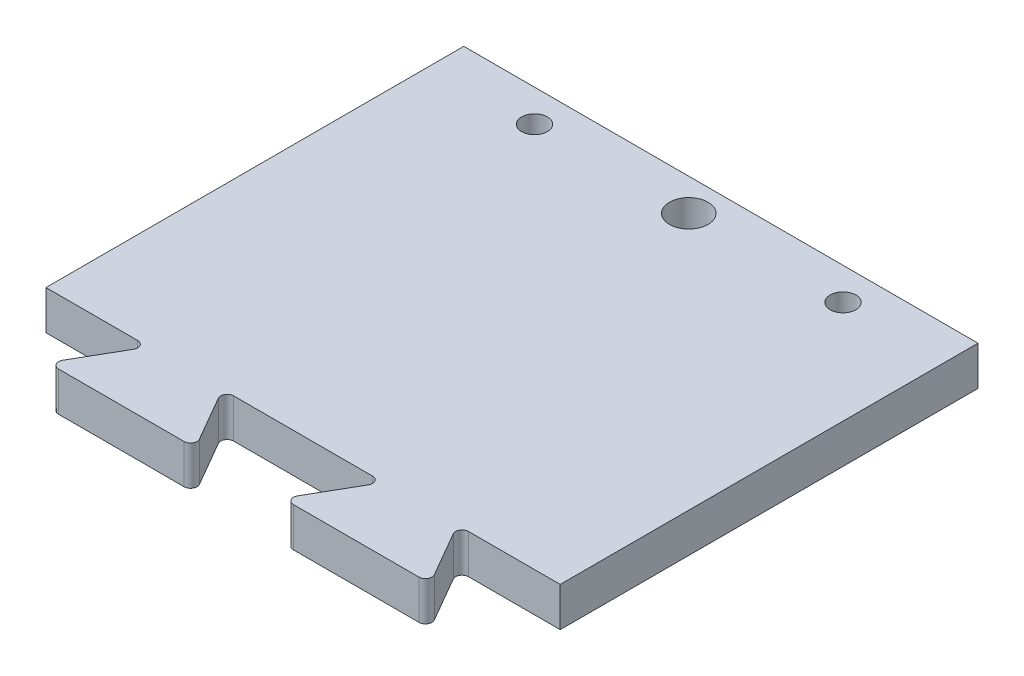
ISO-10303-21;
HEADER;
FILE_DESCRIPTION(('STEP AP214'),'2;1');
FILE_NAME('part.step','',(''),(''),'','','');
FILE_SCHEMA(('AUTOMOTIVE_DESIGN { 1 0 10303 214 1 1 1 1 }'));
ENDSEC;
DATA;
#1=APPLICATION_CONTEXT('core data for automotive mechanical design processes');
#2=APPLICATION_PROTOCOL_DEFINITION('international standard','automotive_design',2000,#1);
#3=PRODUCT_CONTEXT('',#1,'mechanical');
#4=PRODUCT('Part','Part','',(#3));
#5=PRODUCT_RELATED_PRODUCT_CATEGORY('part','',(#4));
#6=PRODUCT_DEFINITION_FORMATION('','',#4);
#7=PRODUCT_DEFINITION_CONTEXT('part definition',#1,'design');
#8=PRODUCT_DEFINITION('design','',#6,#7);
#9=PRODUCT_DEFINITION_SHAPE('','',#8);
#10=(LENGTH_UNIT() NAMED_UNIT(*) SI_UNIT(.MILLI.,.METRE.));
#11=(NAMED_UNIT(*) PLANE_ANGLE_UNIT() SI_UNIT($,.RADIAN.));
#12=(NAMED_UNIT(*) SI_UNIT($,.STERADIAN.) SOLID_ANGLE_UNIT());
#13=UNCERTAINTY_MEASURE_WITH_UNIT(LENGTH_MEASURE(1.E-05),#10,'distance_accuracy_value','');
#14=(GEOMETRIC_REPRESENTATION_CONTEXT(3) GLOBAL_UNCERTAINTY_ASSIGNED_CONTEXT((#13)) GLOBAL_UNIT_ASSIGNED_CONTEXT((#10,
#11,#12)) REPRESENTATION_CONTEXT('',''));
#15=CARTESIAN_POINT('',(0.,0.,0.));
#16=DIRECTION('',(0.,0.,1.));
#17=DIRECTION('',(1.,0.,0.));
#18=AXIS2_PLACEMENT_3D('',#15,#16,#17);
#19=CARTESIAN_POINT('',(8.,3.05,0.));
#20=DIRECTION('',(0.,0.,-1.));
#21=DIRECTION('',(-1.,0.,0.));
#22=AXIS2_PLACEMENT_3D('',#19,#20,#21);
#23=PLANE('',#22);
#24=DIRECTION('',(1.,0.,0.));
#25=VECTOR('',#24,1.);
#26=CARTESIAN_POINT('',(8.,0.,0.));
#27=LINE('',#26,#25);
#28=CARTESIAN_POINT('',(0.,0.,0.));
#29=VERTEX_POINT('',#28);
#30=CARTESIAN_POINT('',(7.13397459621556,0.,0.));
#31=VERTEX_POINT('',#30);
#32=EDGE_CURVE('E220',#29,#31,#27,.T.);
#33=ORIENTED_EDGE('',*,*,#32,.T.);
#34=DIRECTION('',(0.,-1.,0.));
#35=VECTOR('',#34,1.);
#36=CARTESIAN_POINT('',(7.13397459621556,3.05,0.));
#37=LINE('',#36,#35);
#38=CARTESIAN_POINT('',(7.13397459621556,3.05,0.));
#39=VERTEX_POINT('',#38);
#40=EDGE_CURVE('E359',#31,#39,#37,.F.);
#41=ORIENTED_EDGE('',*,*,#40,.T.);
#42=DIRECTION('',(1.,0.,0.));
#43=VECTOR('',#42,1.);
#44=CARTESIAN_POINT('',(8.,3.05,0.));
#45=LINE('',#44,#43);
#46=CARTESIAN_POINT('',(0.,3.05,0.));
#47=VERTEX_POINT('',#46);
#48=EDGE_CURVE('E263',#47,#39,#45,.T.);
#49=ORIENTED_EDGE('',*,*,#48,.F.);
#50=DIRECTION('',(0.,-1.,0.));
#51=VECTOR('',#50,1.);
#52=CARTESIAN_POINT('',(0.,3.05,0.));
#53=LINE('',#52,#51);
#54=EDGE_CURVE('E219',#47,#29,#53,.T.);
#55=ORIENTED_EDGE('',*,*,#54,.T.);
#56=EDGE_LOOP('',(#33,#41,#49,#55));
#57=FACE_BOUND('',#56,.T.);
#58=ADVANCED_FACE('F42',(#57),#23,.F.);
#59=CARTESIAN_POINT('',(5.11324865405184,3.05,5.));
#60=DIRECTION('',(0.866025403784436,0.,0.500000000000004));
#61=DIRECTION('',(0.500000000000004,0.,-0.866025403784436));
#62=AXIS2_PLACEMENT_3D('',#59,#60,#61);
#63=PLANE('',#62);
#64=DIRECTION('',(-0.500000000000004,0.,0.866025403784436));
#65=VECTOR('',#64,1.);
#66=CARTESIAN_POINT('',(5.11324865405184,0.,5.));
#67=LINE('',#66,#65);
#68=CARTESIAN_POINT('',(7.56698729810777,0.,0.750000000000002));
#69=VERTEX_POINT('',#68);
#70=CARTESIAN_POINT('',(5.54626135594406,0.,4.25));
#71=VERTEX_POINT('',#70);
#72=EDGE_CURVE('E224',#69,#71,#67,.T.);
#73=ORIENTED_EDGE('',*,*,#72,.T.);
#74=DIRECTION('',(0.,-1.,0.));
#75=VECTOR('',#74,1.);
#76=CARTESIAN_POINT('',(5.54626135594406,3.05,4.25));
#77=LINE('',#76,#75);
#78=CARTESIAN_POINT('',(5.54626135594406,3.05,4.25));
#79=VERTEX_POINT('',#78);
#80=EDGE_CURVE('E356',#71,#79,#77,.F.);
#81=ORIENTED_EDGE('',*,*,#80,.T.);
#82=DIRECTION('',(-0.500000000000004,0.,0.866025403784436));
#83=VECTOR('',#82,1.);
#84=CARTESIAN_POINT('',(5.11324865405184,3.05,5.));
#85=LINE('',#84,#83);
#86=CARTESIAN_POINT('',(7.56698729810777,3.05,0.750000000000002));
#87=VERTEX_POINT('',#86);
#88=EDGE_CURVE('E394',#87,#79,#85,.T.);
#89=ORIENTED_EDGE('',*,*,#88,.F.);
#90=DIRECTION('',(0.,-1.,0.));
#91=VECTOR('',#90,1.);
#92=CARTESIAN_POINT('',(7.56698729810777,0.,0.750000000000003));
#93=LINE('',#92,#91);
#94=EDGE_CURVE('E352',#87,#69,#93,.T.);
#95=ORIENTED_EDGE('',*,*,#94,.T.);
#96=EDGE_LOOP('',(#73,#81,#89,#95));
#97=FACE_BOUND('',#96,.T.);
#98=ADVANCED_FACE('F397',(#97),#63,.F.);
#99=CARTESIAN_POINT('',(16.6132486540518,3.05,5.));
#100=DIRECTION('',(0.,0.,-1.));
#101=DIRECTION('',(-1.,0.,0.));
#102=AXIS2_PLACEMENT_3D('',#99,#100,#101);
#103=PLANE('',#102);
#104=DIRECTION('',(1.,0.,0.));
#105=VECTOR('',#104,1.);
#106=CARTESIAN_POINT('',(16.6132486540518,0.,5.));
#107=LINE('',#106,#105);
#108=CARTESIAN_POINT('',(5.97927405783628,0.,5.));
#109=VERTEX_POINT('',#108);
#110=CARTESIAN_POINT('',(15.7472232502674,0.,5.));
#111=VERTEX_POINT('',#110);
#112=EDGE_CURVE('E229',#109,#111,#107,.T.);
#113=ORIENTED_EDGE('',*,*,#112,.T.);
#114=DIRECTION('',(0.,-1.,0.));
#115=VECTOR('',#114,1.);
#116=CARTESIAN_POINT('',(15.7472232502674,3.05,5.));
#117=LINE('',#116,#115);
#118=CARTESIAN_POINT('',(15.7472232502674,3.05,5.));
#119=VERTEX_POINT('',#118);
#120=EDGE_CURVE('E349',#111,#119,#117,.F.);
#121=ORIENTED_EDGE('',*,*,#120,.T.);
#122=DIRECTION('',(1.,0.,0.));
#123=VECTOR('',#122,1.);
#124=CARTESIAN_POINT('',(16.6132486540518,3.05,5.));
#125=LINE('',#124,#123);
#126=CARTESIAN_POINT('',(5.97927405783628,3.05,5.));
#127=VERTEX_POINT('',#126);
#128=EDGE_CURVE('E400',#127,#119,#125,.T.);
#129=ORIENTED_EDGE('',*,*,#128,.F.);
#130=DIRECTION('',(0.,-1.,0.));
#131=VECTOR('',#130,1.);
#132=CARTESIAN_POINT('',(5.97927405783628,3.05,5.));
#133=LINE('',#132,#131);
#134=EDGE_CURVE('E345',#127,#109,#133,.T.);
#135=ORIENTED_EDGE('',*,*,#134,.T.);
#136=EDGE_LOOP('',(#113,#121,#129,#135));
#137=FACE_BOUND('',#136,.T.);
#138=ADVANCED_FACE('F453',(#137),#103,.F.);
#139=CARTESIAN_POINT('',(13.7264973081037,3.05,0.));
#140=DIRECTION('',(-0.866025403784436,0.,0.500000000000004));
#141=DIRECTION('',(0.500000000000005,0.,0.866025403784436));
#142=AXIS2_PLACEMENT_3D('',#139,#140,#141);
#143=PLANE('',#142);
#144=DIRECTION('',(-0.500000000000005,0.,-0.866025403784436));
#145=VECTOR('',#144,1.);
#146=CARTESIAN_POINT('',(13.7264973081037,0.,0.));
#147=LINE('',#146,#145);
#148=CARTESIAN_POINT('',(16.1802359521596,0.,4.25));
#149=VERTEX_POINT('',#148);
#150=CARTESIAN_POINT('',(14.1595100099959,0.,0.750000000000005));
#151=VERTEX_POINT('',#150);
#152=EDGE_CURVE('E233',#149,#151,#147,.T.);
#153=ORIENTED_EDGE('',*,*,#152,.T.);
#154=DIRECTION('',(0.,-1.,0.));
#155=VECTOR('',#154,1.);
#156=CARTESIAN_POINT('',(14.1595100099959,3.05,0.750000000000005));
#157=LINE('',#156,#155);
#158=CARTESIAN_POINT('',(14.1595100099959,3.05,0.750000000000005));
#159=VERTEX_POINT('',#158);
#160=EDGE_CURVE('E342',#151,#159,#157,.F.);
#161=ORIENTED_EDGE('',*,*,#160,.T.);
#162=DIRECTION('',(-0.500000000000005,0.,-0.866025403784436));
#163=VECTOR('',#162,1.);
#164=CARTESIAN_POINT('',(13.7264973081037,3.05,0.));
#165=LINE('',#164,#163);
#166=CARTESIAN_POINT('',(16.1802359521596,3.05,4.25));
#167=VERTEX_POINT('',#166);
#168=EDGE_CURVE('E405',#167,#159,#165,.T.);
#169=ORIENTED_EDGE('',*,*,#168,.F.);
#170=DIRECTION('',(0.,-1.,0.));
#171=VECTOR('',#170,1.);
#172=CARTESIAN_POINT('',(16.1802359521596,3.05,4.25));
#173=LINE('',#172,#171);
#174=EDGE_CURVE('E338',#167,#149,#173,.T.);
#175=ORIENTED_EDGE('',*,*,#174,.T.);
#176=EDGE_LOOP('',(#153,#161,#169,#175));
#177=FACE_BOUND('',#176,.T.);
#178=ADVANCED_FACE('F495',(#177),#143,.F.);
#179=CARTESIAN_POINT('',(26.2735026918963,3.05,0.));
#180=DIRECTION('',(0.,0.,-1.));
#181=DIRECTION('',(-1.,0.,0.));
#182=AXIS2_PLACEMENT_3D('',#179,#180,#181);
#183=PLANE('',#182);
#184=DIRECTION('',(1.,0.,0.));
#185=VECTOR('',#184,1.);
#186=CARTESIAN_POINT('',(26.2735026918963,0.,0.));
#187=LINE('',#186,#185);
#188=CARTESIAN_POINT('',(14.5925227118881,0.,0.));
#189=VERTEX_POINT('',#188);
#190=CARTESIAN_POINT('',(25.4074772881119,0.,0.));
#191=VERTEX_POINT('',#190);
#192=EDGE_CURVE('E237',#189,#191,#187,.T.);
#193=ORIENTED_EDGE('',*,*,#192,.T.);
#194=DIRECTION('',(0.,-1.,0.));
#195=VECTOR('',#194,1.);
#196=CARTESIAN_POINT('',(25.4074772881119,3.05,0.));
#197=LINE('',#196,#195);
#198=CARTESIAN_POINT('',(25.4074772881119,3.05,0.));
#199=VERTEX_POINT('',#198);
#200=EDGE_CURVE('E335',#191,#199,#197,.F.);
#201=ORIENTED_EDGE('',*,*,#200,.T.);
#202=DIRECTION('',(1.,0.,0.));
#203=VECTOR('',#202,1.);
#204=CARTESIAN_POINT('',(26.2735026918963,3.05,0.));
#205=LINE('',#204,#203);
#206=CARTESIAN_POINT('',(14.5925227118881,3.05,0.));
#207=VERTEX_POINT('',#206);
#208=EDGE_CURVE('E413',#207,#199,#205,.T.);
#209=ORIENTED_EDGE('',*,*,#208,.F.);
#210=DIRECTION('',(0.,-1.,0.));
#211=VECTOR('',#210,1.);
#212=CARTESIAN_POINT('',(14.5925227118881,0.,0.));
#213=LINE('',#212,#211);
#214=EDGE_CURVE('E331',#207,#189,#213,.T.);
#215=ORIENTED_EDGE('',*,*,#214,.T.);
#216=EDGE_LOOP('',(#193,#201,#209,#215));
#217=FACE_BOUND('',#216,.T.);
#218=ADVANCED_FACE('F501',(#217),#183,.F.);
#219=CARTESIAN_POINT('',(23.3867513459482,3.05,5.));
#220=DIRECTION('',(0.866025403784436,0.,0.500000000000004));
#221=DIRECTION('',(0.500000000000004,0.,-0.866025403784436));
#222=AXIS2_PLACEMENT_3D('',#219,#220,#221);
#223=PLANE('',#222);
#224=DIRECTION('',(-0.500000000000004,0.,0.866025403784436));
#225=VECTOR('',#224,1.);
#226=CARTESIAN_POINT('',(23.3867513459482,0.,5.));
#227=LINE('',#226,#225);
#228=CARTESIAN_POINT('',(25.8404899900041,0.,0.750000000000001));
#229=VERTEX_POINT('',#228);
#230=CARTESIAN_POINT('',(23.8197640478404,0.,4.25));
#231=VERTEX_POINT('',#230);
#232=EDGE_CURVE('E241',#229,#231,#227,.T.);
#233=ORIENTED_EDGE('',*,*,#232,.T.);
#234=DIRECTION('',(0.,-1.,0.));
#235=VECTOR('',#234,1.);
#236=CARTESIAN_POINT('',(23.8197640478404,3.05,4.25));
#237=LINE('',#236,#235);
#238=CARTESIAN_POINT('',(23.8197640478404,3.05,4.25));
#239=VERTEX_POINT('',#238);
#240=EDGE_CURVE('E58',#231,#239,#237,.F.);
#241=ORIENTED_EDGE('',*,*,#240,.T.);
#242=DIRECTION('',(-0.500000000000004,0.,0.866025403784436));
#243=VECTOR('',#242,1.);
#244=CARTESIAN_POINT('',(23.3867513459482,3.05,5.));
#245=LINE('',#244,#243);
#246=CARTESIAN_POINT('',(25.8404899900041,3.05,0.750000000000001));
#247=VERTEX_POINT('',#246);
#248=EDGE_CURVE('E416',#247,#239,#245,.T.);
#249=ORIENTED_EDGE('',*,*,#248,.F.);
#250=DIRECTION('',(0.,-1.,0.));
#251=VECTOR('',#250,1.);
#252=CARTESIAN_POINT('',(25.8404899900041,0.,0.750000000000001));
#253=LINE('',#252,#251);
#254=EDGE_CURVE('E325',#247,#229,#253,.T.);
#255=ORIENTED_EDGE('',*,*,#254,.T.);
#256=EDGE_LOOP('',(#233,#241,#249,#255));
#257=FACE_BOUND('',#256,.T.);
#258=ADVANCED_FACE('F506',(#257),#223,.F.);
#259=CARTESIAN_POINT('',(34.8867513459482,3.05,5.));
#260=DIRECTION('',(0.,0.,-1.));
#261=DIRECTION('',(-1.,0.,0.));
#262=AXIS2_PLACEMENT_3D('',#259,#260,#261);
#263=PLANE('',#262);
#264=DIRECTION('',(1.,0.,0.));
#265=VECTOR('',#264,1.);
#266=CARTESIAN_POINT('',(34.8867513459482,0.,5.));
#267=LINE('',#266,#265);
#268=CARTESIAN_POINT('',(24.2527767497326,0.,5.));
#269=VERTEX_POINT('',#268);
#270=CARTESIAN_POINT('',(34.0207259421637,0.,5.));
#271=VERTEX_POINT('',#270);
#272=EDGE_CURVE('E244',#269,#271,#267,.T.);
#273=ORIENTED_EDGE('',*,*,#272,.T.);
#274=DIRECTION('',(0.,-1.,0.));
#275=VECTOR('',#274,1.);
#276=CARTESIAN_POINT('',(34.0207259421637,3.05,5.));
#277=LINE('',#276,#275);
#278=CARTESIAN_POINT('',(34.0207259421637,3.05,5.));
#279=VERTEX_POINT('',#278);
#280=EDGE_CURVE('E310',#271,#279,#277,.F.);
#281=ORIENTED_EDGE('',*,*,#280,.T.);
#282=DIRECTION('',(1.,0.,0.));
#283=VECTOR('',#282,1.);
#284=CARTESIAN_POINT('',(34.8867513459482,3.05,5.));
#285=LINE('',#284,#283);
#286=CARTESIAN_POINT('',(24.2527767497326,3.05,5.));
#287=VERTEX_POINT('',#286);
#288=EDGE_CURVE('E419',#287,#279,#285,.T.);
#289=ORIENTED_EDGE('',*,*,#288,.F.);
#290=DIRECTION('',(0.,-1.,0.));
#291=VECTOR('',#290,1.);
#292=CARTESIAN_POINT('',(24.2527767497326,3.05,5.));
#293=LINE('',#292,#291);
#294=EDGE_CURVE('E306',#287,#269,#293,.T.);
#295=ORIENTED_EDGE('',*,*,#294,.T.);
#296=EDGE_LOOP('',(#273,#281,#289,#295));
#297=FACE_BOUND('',#296,.T.);
#298=ADVANCED_FACE('F512',(#297),#263,.F.);
#299=CARTESIAN_POINT('',(32.,3.05,0.));
#300=DIRECTION('',(-0.866025403784436,0.,0.500000000000004));
#301=DIRECTION('',(0.500000000000004,0.,0.866025403784436));
#302=AXIS2_PLACEMENT_3D('',#299,#300,#301);
#303=PLANE('',#302);
#304=DIRECTION('',(-0.500000000000004,0.,-0.866025403784436));
#305=VECTOR('',#304,1.);
#306=CARTESIAN_POINT('',(32.,0.,0.));
#307=LINE('',#306,#305);
#308=CARTESIAN_POINT('',(34.4537386440559,0.,4.25));
#309=VERTEX_POINT('',#308);
#310=CARTESIAN_POINT('',(32.4330127018922,0.,0.750000000000007));
#311=VERTEX_POINT('',#310);
#312=EDGE_CURVE('E248',#309,#311,#307,.T.);
#313=ORIENTED_EDGE('',*,*,#312,.T.);
#314=DIRECTION('',(0.,-1.,0.));
#315=VECTOR('',#314,1.);
#316=CARTESIAN_POINT('',(32.4330127018922,3.05,0.750000000000006));
#317=LINE('',#316,#315);
#318=CARTESIAN_POINT('',(32.4330127018922,3.05,0.750000000000007));
#319=VERTEX_POINT('',#318);
#320=EDGE_CURVE('E291',#311,#319,#317,.F.);
#321=ORIENTED_EDGE('',*,*,#320,.T.);
#322=DIRECTION('',(-0.500000000000004,0.,-0.866025403784436));
#323=VECTOR('',#322,1.);
#324=CARTESIAN_POINT('',(32.,3.05,0.));
#325=LINE('',#324,#323);
#326=CARTESIAN_POINT('',(34.4537386440559,3.05,4.25));
#327=VERTEX_POINT('',#326);
#328=EDGE_CURVE('E193',#327,#319,#325,.T.);
#329=ORIENTED_EDGE('',*,*,#328,.F.);
#330=DIRECTION('',(0.,-1.,0.));
#331=VECTOR('',#330,1.);
#332=CARTESIAN_POINT('',(34.4537386440559,3.05,4.25));
#333=LINE('',#332,#331);
#334=EDGE_CURVE('E287',#327,#309,#333,.T.);
#335=ORIENTED_EDGE('',*,*,#334,.T.);
#336=EDGE_LOOP('',(#313,#321,#329,#335));
#337=FACE_BOUND('',#336,.T.);
#338=ADVANCED_FACE('F514',(#337),#303,.F.);
#339=CARTESIAN_POINT('',(40.,3.05,0.));
#340=DIRECTION('',(0.,0.,-1.));
#341=DIRECTION('',(-1.,0.,0.));
#342=AXIS2_PLACEMENT_3D('',#339,#340,#341);
#343=PLANE('',#342);
#344=DIRECTION('',(1.,0.,0.));
#345=VECTOR('',#344,1.);
#346=CARTESIAN_POINT('',(40.,3.05,0.));
#347=LINE('',#346,#345);
#348=CARTESIAN_POINT('',(32.8660254037845,3.05,0.));
#349=VERTEX_POINT('',#348);
#350=CARTESIAN_POINT('',(40.,3.05,0.));
#351=VERTEX_POINT('',#350);
#352=EDGE_CURVE('E179',#349,#351,#347,.T.);
#353=ORIENTED_EDGE('',*,*,#352,.F.);
#354=DIRECTION('',(0.,-1.,0.));
#355=VECTOR('',#354,1.);
#356=CARTESIAN_POINT('',(32.8660254037845,0.,0.));
#357=LINE('',#356,#355);
#358=CARTESIAN_POINT('',(32.8660254037845,0.,0.));
#359=VERTEX_POINT('',#358);
#360=EDGE_CURVE('E203',#349,#359,#357,.T.);
#361=ORIENTED_EDGE('',*,*,#360,.T.);
#362=DIRECTION('',(1.,0.,0.));
#363=VECTOR('',#362,1.);
#364=CARTESIAN_POINT('',(40.,0.,0.));
#365=LINE('',#364,#363);
#366=CARTESIAN_POINT('',(40.,0.,0.));
#367=VERTEX_POINT('',#366);
#368=EDGE_CURVE('E199',#359,#367,#365,.T.);
#369=ORIENTED_EDGE('',*,*,#368,.T.);
#370=DIRECTION('',(0.,-1.,0.));
#371=VECTOR('',#370,1.);
#372=CARTESIAN_POINT('',(40.,3.05,0.));
#373=LINE('',#372,#371);
#374=EDGE_CURVE('E196',#351,#367,#373,.T.);
#375=ORIENTED_EDGE('',*,*,#374,.F.);
#376=EDGE_LOOP('',(#353,#361,#369,#375));
#377=FACE_BOUND('',#376,.T.);
#378=ADVANCED_FACE('F197',(#377),#343,.F.);
#379=CARTESIAN_POINT('',(40.,3.05,-32.5));
#380=DIRECTION('',(-1.,0.,0.));
#381=DIRECTION('',(0.,0.,1.));
#382=AXIS2_PLACEMENT_3D('',#379,#380,#381);
#383=PLANE('',#382);
#384=DIRECTION('',(0.,0.,-1.));
#385=VECTOR('',#384,1.);
#386=CARTESIAN_POINT('',(40.,0.,-32.5));
#387=LINE('',#386,#385);
#388=CARTESIAN_POINT('',(40.,0.,-32.5));
#389=VERTEX_POINT('',#388);
#390=EDGE_CURVE('E254',#367,#389,#387,.T.);
#391=ORIENTED_EDGE('',*,*,#390,.T.);
#392=DIRECTION('',(0.,-1.,0.));
#393=VECTOR('',#392,1.);
#394=CARTESIAN_POINT('',(40.,3.05,-32.5));
#395=LINE('',#394,#393);
#396=CARTESIAN_POINT('',(40.,3.05,-32.5));
#397=VERTEX_POINT('',#396);
#398=EDGE_CURVE('E204',#397,#389,#395,.T.);
#399=ORIENTED_EDGE('',*,*,#398,.F.);
#400=DIRECTION('',(0.,0.,-1.));
#401=VECTOR('',#400,1.);
#402=CARTESIAN_POINT('',(40.,3.05,-32.5));
#403=LINE('',#402,#401);
#404=EDGE_CURVE('E184',#351,#397,#403,.T.);
#405=ORIENTED_EDGE('',*,*,#404,.F.);
#406=ORIENTED_EDGE('',*,*,#374,.T.);
#407=EDGE_LOOP('',(#391,#399,#405,#406));
#408=FACE_BOUND('',#407,.T.);
#409=ADVANCED_FACE('F206',(#408),#383,.F.);
#410=CARTESIAN_POINT('',(0.,3.05,-32.5));
#411=DIRECTION('',(0.,0.,1.));
#412=DIRECTION('',(1.,0.,0.));
#413=AXIS2_PLACEMENT_3D('',#410,#411,#412);
#414=PLANE('',#413);
#415=DIRECTION('',(-1.,0.,0.));
#416=VECTOR('',#415,1.);
#417=CARTESIAN_POINT('',(0.,0.,-32.5));
#418=LINE('',#417,#416);
#419=CARTESIAN_POINT('',(0.,0.,-32.5));
#420=VERTEX_POINT('',#419);
#421=EDGE_CURVE('E257',#389,#420,#418,.T.);
#422=ORIENTED_EDGE('',*,*,#421,.T.);
#423=DIRECTION('',(0.,-1.,0.));
#424=VECTOR('',#423,1.);
#425=CARTESIAN_POINT('',(0.,3.05,-32.5));
#426=LINE('',#425,#424);
#427=CARTESIAN_POINT('',(0.,3.05,-32.5));
#428=VERTEX_POINT('',#427);
#429=EDGE_CURVE('E267',#428,#420,#426,.T.);
#430=ORIENTED_EDGE('',*,*,#429,.F.);
#431=DIRECTION('',(-1.,0.,0.));
#432=VECTOR('',#431,1.);
#433=CARTESIAN_POINT('',(0.,3.05,-32.5));
#434=LINE('',#433,#432);
#435=EDGE_CURVE('E210',#397,#428,#434,.T.);
#436=ORIENTED_EDGE('',*,*,#435,.F.);
#437=ORIENTED_EDGE('',*,*,#398,.T.);
#438=EDGE_LOOP('',(#422,#430,#436,#437));
#439=FACE_BOUND('',#438,.T.);
#440=ADVANCED_FACE('F431',(#439),#414,.F.);
#441=CARTESIAN_POINT('',(0.,3.05,0.));
#442=DIRECTION('',(1.,0.,0.));
#443=DIRECTION('',(0.,0.,-1.));
#444=AXIS2_PLACEMENT_3D('',#441,#442,#443);
#445=PLANE('',#444);
#446=DIRECTION('',(0.,0.,1.));
#447=VECTOR('',#446,1.);
#448=CARTESIAN_POINT('',(0.,0.,0.));
#449=LINE('',#448,#447);
#450=EDGE_CURVE('E260',#420,#29,#449,.T.);
#451=ORIENTED_EDGE('',*,*,#450,.T.);
#452=ORIENTED_EDGE('',*,*,#54,.F.);
#453=DIRECTION('',(0.,0.,1.));
#454=VECTOR('',#453,1.);
#455=CARTESIAN_POINT('',(0.,3.05,0.));
#456=LINE('',#455,#454);
#457=EDGE_CURVE('E213',#428,#47,#456,.T.);
#458=ORIENTED_EDGE('',*,*,#457,.F.);
#459=ORIENTED_EDGE('',*,*,#429,.T.);
#460=EDGE_LOOP('',(#451,#452,#458,#459));
#461=FACE_BOUND('',#460,.T.);
#462=ADVANCED_FACE('F435',(#461),#445,.F.);
#463=CARTESIAN_POINT('',(0.,3.05,0.));
#464=DIRECTION('',(0.,-1.,0.));
#465=DIRECTION('',(0.,0.,-1.));
#466=AXIS2_PLACEMENT_3D('',#463,#464,#465);
#467=PLANE('',#466);
#468=CARTESIAN_POINT('',(8.,3.05,-30.));
#469=DIRECTION('',(0.,1.,0.));
#470=DIRECTION('',(0.,0.,1.));
#471=AXIS2_PLACEMENT_3D('',#468,#469,#470);
#472=CIRCLE('',#471,1.);
#473=CARTESIAN_POINT('',(8.,3.05,-29.));
#474=VERTEX_POINT('',#473);
#475=EDGE_CURVE('E278',#474,#474,#472,.T.);
#476=ORIENTED_EDGE('',*,*,#475,.F.);
#477=EDGE_LOOP('',(#476));
#478=FACE_BOUND('',#477,.T.);
#479=CARTESIAN_POINT('',(32.,3.05,-30.));
#480=DIRECTION('',(0.,1.,0.));
#481=DIRECTION('',(0.,0.,1.));
#482=AXIS2_PLACEMENT_3D('',#479,#480,#481);
#483=CIRCLE('',#482,0.999999999999998);
#484=CARTESIAN_POINT('',(32.,3.05,-29.));
#485=VERTEX_POINT('',#484);
#486=EDGE_CURVE('E746',#485,#485,#483,.T.);
#487=ORIENTED_EDGE('',*,*,#486,.F.);
#488=EDGE_LOOP('',(#487));
#489=FACE_BOUND('',#488,.T.);
#490=CARTESIAN_POINT('',(20.,3.05,-30.));
#491=DIRECTION('',(0.,1.,0.));
#492=DIRECTION('',(0.,0.,1.));
#493=AXIS2_PLACEMENT_3D('',#490,#491,#492);
#494=CIRCLE('',#493,1.5);
#495=CARTESIAN_POINT('',(20.,3.05,-28.5));
#496=VERTEX_POINT('',#495);
#497=EDGE_CURVE('E743',#496,#496,#494,.T.);
#498=ORIENTED_EDGE('',*,*,#497,.F.);
#499=EDGE_LOOP('',(#498));
#500=FACE_BOUND('',#499,.T.);
#501=ORIENTED_EDGE('',*,*,#288,.T.);
#502=CARTESIAN_POINT('',(34.0207259421637,3.05,4.5));
#503=DIRECTION('',(0.,-1.,0.));
#504=DIRECTION('',(0.,0.,-1.));
#505=AXIS2_PLACEMENT_3D('',#502,#503,#504);
#506=CIRCLE('',#505,0.5);
#507=EDGE_CURVE('E322',#279,#327,#506,.F.);
#508=ORIENTED_EDGE('',*,*,#507,.T.);
#509=ORIENTED_EDGE('',*,*,#328,.T.);
#510=CARTESIAN_POINT('',(32.8660254037845,3.05,0.500000000000001));
#511=DIRECTION('',(0.,-1.,0.));
#512=DIRECTION('',(0.,0.,-1.));
#513=AXIS2_PLACEMENT_3D('',#510,#511,#512);
#514=CIRCLE('',#513,0.5);
#515=EDGE_CURVE('E188',#319,#349,#514,.T.);
#516=ORIENTED_EDGE('',*,*,#515,.T.);
#517=ORIENTED_EDGE('',*,*,#352,.T.);
#518=ORIENTED_EDGE('',*,*,#404,.T.);
#519=ORIENTED_EDGE('',*,*,#435,.T.);
#520=ORIENTED_EDGE('',*,*,#457,.T.);
#521=ORIENTED_EDGE('',*,*,#48,.T.);
#522=CARTESIAN_POINT('',(7.13397459621556,3.05,0.5));
#523=DIRECTION('',(0.,-1.,0.));
#524=DIRECTION('',(0.,0.,-1.));
#525=AXIS2_PLACEMENT_3D('',#522,#523,#524);
#526=CIRCLE('',#525,0.5);
#527=EDGE_CURVE('E11',#39,#87,#526,.T.);
#528=ORIENTED_EDGE('',*,*,#527,.T.);
#529=ORIENTED_EDGE('',*,*,#88,.T.);
#530=CARTESIAN_POINT('',(5.97927405783628,3.05,4.5));
#531=DIRECTION('',(0.,-1.,0.));
#532=DIRECTION('',(0.,0.,-1.));
#533=AXIS2_PLACEMENT_3D('',#530,#531,#532);
#534=CIRCLE('',#533,0.5);
#535=EDGE_CURVE('E313',#79,#127,#534,.F.);
#536=ORIENTED_EDGE('',*,*,#535,.T.);
#537=ORIENTED_EDGE('',*,*,#128,.T.);
#538=CARTESIAN_POINT('',(15.7472232502674,3.05,4.5));
#539=DIRECTION('',(0.,-1.,0.));
#540=DIRECTION('',(0.,0.,-1.));
#541=AXIS2_PLACEMENT_3D('',#538,#539,#540);
#542=CIRCLE('',#541,0.5);
#543=EDGE_CURVE('E316',#119,#167,#542,.F.);
#544=ORIENTED_EDGE('',*,*,#543,.T.);
#545=ORIENTED_EDGE('',*,*,#168,.T.);
#546=CARTESIAN_POINT('',(14.5925227118881,3.05,0.500000000000001));
#547=DIRECTION('',(0.,-1.,0.));
#548=DIRECTION('',(0.,0.,-1.));
#549=AXIS2_PLACEMENT_3D('',#546,#547,#548);
#550=CIRCLE('',#549,0.5);
#551=EDGE_CURVE('E375',#159,#207,#550,.T.);
#552=ORIENTED_EDGE('',*,*,#551,.T.);
#553=ORIENTED_EDGE('',*,*,#208,.T.);
#554=CARTESIAN_POINT('',(25.4074772881119,3.05,0.499999999999999));
#555=DIRECTION('',(0.,-1.,0.));
#556=DIRECTION('',(0.,0.,-1.));
#557=AXIS2_PLACEMENT_3D('',#554,#555,#556);
#558=CIRCLE('',#557,0.5);
#559=EDGE_CURVE('E65',#199,#247,#558,.T.);
#560=ORIENTED_EDGE('',*,*,#559,.T.);
#561=ORIENTED_EDGE('',*,*,#248,.T.);
#562=CARTESIAN_POINT('',(24.2527767497326,3.05,4.5));
#563=DIRECTION('',(0.,-1.,0.));
#564=DIRECTION('',(0.,0.,-1.));
#565=AXIS2_PLACEMENT_3D('',#562,#563,#564);
#566=CIRCLE('',#565,0.5);
#567=EDGE_CURVE('E319',#239,#287,#566,.F.);
#568=ORIENTED_EDGE('',*,*,#567,.T.);
#569=EDGE_LOOP('',(#501,#508,#509,#516,#517,#518,#519,#520,#521,#528,#529,#536,#537,#544,#545,
#552,#553,#560,#561,#568));
#570=FACE_BOUND('',#569,.T.);
#571=ADVANCED_FACE('F182',(#478,#489,#500,#570),#467,.F.);
#572=CARTESIAN_POINT('',(0.,0.,0.));
#573=DIRECTION('',(0.,-1.,0.));
#574=DIRECTION('',(0.,0.,-1.));
#575=AXIS2_PLACEMENT_3D('',#572,#573,#574);
#576=PLANE('',#575);
#577=CARTESIAN_POINT('',(8.,0.,-30.));
#578=DIRECTION('',(0.,-1.,0.));
#579=DIRECTION('',(0.,0.,-1.));
#580=AXIS2_PLACEMENT_3D('',#577,#578,#579);
#581=CIRCLE('',#580,1.);
#582=CARTESIAN_POINT('',(8.,0.,-31.));
#583=VERTEX_POINT('',#582);
#584=EDGE_CURVE('E225',#583,#583,#581,.T.);
#585=ORIENTED_EDGE('',*,*,#584,.F.);
#586=EDGE_LOOP('',(#585));
#587=FACE_BOUND('',#586,.T.);
#588=CARTESIAN_POINT('',(32.,0.,-30.));
#589=DIRECTION('',(0.,-1.,0.));
#590=DIRECTION('',(0.,0.,-1.));
#591=AXIS2_PLACEMENT_3D('',#588,#589,#590);
#592=CIRCLE('',#591,0.999999999999998);
#593=CARTESIAN_POINT('',(32.,0.,-31.));
#594=VERTEX_POINT('',#593);
#595=EDGE_CURVE('E277',#594,#594,#592,.T.);
#596=ORIENTED_EDGE('',*,*,#595,.F.);
#597=EDGE_LOOP('',(#596));
#598=FACE_BOUND('',#597,.T.);
#599=CARTESIAN_POINT('',(20.,0.,-30.));
#600=DIRECTION('',(0.,-1.,0.));
#601=DIRECTION('',(0.,0.,-1.));
#602=AXIS2_PLACEMENT_3D('',#599,#600,#601);
#603=CIRCLE('',#602,1.5);
#604=CARTESIAN_POINT('',(20.,0.,-31.5));
#605=VERTEX_POINT('',#604);
#606=EDGE_CURVE('E273',#605,#605,#603,.T.);
#607=ORIENTED_EDGE('',*,*,#606,.F.);
#608=EDGE_LOOP('',(#607));
#609=FACE_BOUND('',#608,.T.);
#610=ORIENTED_EDGE('',*,*,#312,.F.);
#611=CARTESIAN_POINT('',(34.0207259421637,0.,4.5));
#612=DIRECTION('',(0.,-1.,0.));
#613=DIRECTION('',(0.,0.,-1.));
#614=AXIS2_PLACEMENT_3D('',#611,#612,#613);
#615=CIRCLE('',#614,0.5);
#616=EDGE_CURVE('E303',#309,#271,#615,.T.);
#617=ORIENTED_EDGE('',*,*,#616,.T.);
#618=ORIENTED_EDGE('',*,*,#272,.F.);
#619=CARTESIAN_POINT('',(24.2527767497326,0.,4.5));
#620=DIRECTION('',(0.,-1.,0.));
#621=DIRECTION('',(0.,0.,-1.));
#622=AXIS2_PLACEMENT_3D('',#619,#620,#621);
#623=CIRCLE('',#622,0.5);
#624=EDGE_CURVE('E300',#269,#231,#623,.T.);
#625=ORIENTED_EDGE('',*,*,#624,.T.);
#626=ORIENTED_EDGE('',*,*,#232,.F.);
#627=CARTESIAN_POINT('',(25.4074772881119,0.,0.499999999999999));
#628=DIRECTION('',(0.,-1.,0.));
#629=DIRECTION('',(0.,0.,-1.));
#630=AXIS2_PLACEMENT_3D('',#627,#628,#629);
#631=CIRCLE('',#630,0.5);
#632=EDGE_CURVE('E367',#229,#191,#631,.F.);
#633=ORIENTED_EDGE('',*,*,#632,.T.);
#634=ORIENTED_EDGE('',*,*,#192,.F.);
#635=CARTESIAN_POINT('',(14.5925227118881,0.,0.500000000000001));
#636=DIRECTION('',(0.,-1.,0.));
#637=DIRECTION('',(0.,0.,-1.));
#638=AXIS2_PLACEMENT_3D('',#635,#636,#637);
#639=CIRCLE('',#638,0.5);
#640=EDGE_CURVE('E372',#189,#151,#639,.F.);
#641=ORIENTED_EDGE('',*,*,#640,.T.);
#642=ORIENTED_EDGE('',*,*,#152,.F.);
#643=CARTESIAN_POINT('',(15.7472232502674,0.,4.5));
#644=DIRECTION('',(0.,-1.,0.));
#645=DIRECTION('',(0.,0.,-1.));
#646=AXIS2_PLACEMENT_3D('',#643,#644,#645);
#647=CIRCLE('',#646,0.5);
#648=EDGE_CURVE('E297',#149,#111,#647,.T.);
#649=ORIENTED_EDGE('',*,*,#648,.T.);
#650=ORIENTED_EDGE('',*,*,#112,.F.);
#651=CARTESIAN_POINT('',(5.97927405783628,0.,4.5));
#652=DIRECTION('',(0.,-1.,0.));
#653=DIRECTION('',(0.,0.,-1.));
#654=AXIS2_PLACEMENT_3D('',#651,#652,#653);
#655=CIRCLE('',#654,0.5);
#656=EDGE_CURVE('E294',#109,#71,#655,.T.);
#657=ORIENTED_EDGE('',*,*,#656,.T.);
#658=ORIENTED_EDGE('',*,*,#72,.F.);
#659=CARTESIAN_POINT('',(7.13397459621556,0.,0.5));
#660=DIRECTION('',(0.,-1.,0.));
#661=DIRECTION('',(0.,0.,-1.));
#662=AXIS2_PLACEMENT_3D('',#659,#660,#661);
#663=CIRCLE('',#662,0.5);
#664=EDGE_CURVE('E51',#69,#31,#663,.F.);
#665=ORIENTED_EDGE('',*,*,#664,.T.);
#666=ORIENTED_EDGE('',*,*,#32,.F.);
#667=ORIENTED_EDGE('',*,*,#450,.F.);
#668=ORIENTED_EDGE('',*,*,#421,.F.);
#669=ORIENTED_EDGE('',*,*,#390,.F.);
#670=ORIENTED_EDGE('',*,*,#368,.F.);
#671=CARTESIAN_POINT('',(32.8660254037845,0.,0.500000000000001));
#672=DIRECTION('',(0.,-1.,0.));
#673=DIRECTION('',(0.,0.,-1.));
#674=AXIS2_PLACEMENT_3D('',#671,#672,#673);
#675=CIRCLE('',#674,0.5);
#676=EDGE_CURVE('E362',#359,#311,#675,.F.);
#677=ORIENTED_EDGE('',*,*,#676,.T.);
#678=EDGE_LOOP('',(#610,#617,#618,#625,#626,#633,#634,#641,#642,#649,#650,#657,#658,#665,#666,
#667,#668,#669,#670,#677));
#679=FACE_BOUND('',#678,.T.);
#680=ADVANCED_FACE('F382',(#587,#598,#609,#679),#576,.T.);
#681=CARTESIAN_POINT('',(20.,-6.95,-30.));
#682=DIRECTION('',(0.,1.,0.));
#683=DIRECTION('',(0.,0.,1.));
#684=AXIS2_PLACEMENT_3D('',#681,#682,#683);
#685=CYLINDRICAL_SURFACE('',#684,1.5);
#686=ORIENTED_EDGE('',*,*,#606,.T.);
#687=EDGE_LOOP('',(#686));
#688=FACE_BOUND('',#687,.T.);
#689=ORIENTED_EDGE('',*,*,#497,.T.);
#690=EDGE_LOOP('',(#689));
#691=FACE_BOUND('',#690,.T.);
#692=ADVANCED_FACE('F587',(#688,#691),#685,.F.);
#693=CARTESIAN_POINT('',(32.,-6.95,-30.));
#694=DIRECTION('',(0.,1.,0.));
#695=DIRECTION('',(0.,0.,1.));
#696=AXIS2_PLACEMENT_3D('',#693,#694,#695);
#697=CYLINDRICAL_SURFACE('',#696,0.999999999999998);
#698=ORIENTED_EDGE('',*,*,#595,.T.);
#699=EDGE_LOOP('',(#698));
#700=FACE_BOUND('',#699,.T.);
#701=ORIENTED_EDGE('',*,*,#486,.T.);
#702=EDGE_LOOP('',(#701));
#703=FACE_BOUND('',#702,.T.);
#704=ADVANCED_FACE('F592',(#700,#703),#697,.F.);
#705=CARTESIAN_POINT('',(8.,-6.95,-30.));
#706=DIRECTION('',(0.,1.,0.));
#707=DIRECTION('',(0.,0.,1.));
#708=AXIS2_PLACEMENT_3D('',#705,#706,#707);
#709=CYLINDRICAL_SURFACE('',#708,1.);
#710=ORIENTED_EDGE('',*,*,#584,.T.);
#711=EDGE_LOOP('',(#710));
#712=FACE_BOUND('',#711,.T.);
#713=ORIENTED_EDGE('',*,*,#475,.T.);
#714=EDGE_LOOP('',(#713));
#715=FACE_BOUND('',#714,.T.);
#716=ADVANCED_FACE('F460',(#712,#715),#709,.F.);
#717=CARTESIAN_POINT('',(32.8660254037845,3.05,0.500000000000001));
#718=DIRECTION('',(0.,1.,0.));
#719=DIRECTION('',(0.,0.,1.));
#720=AXIS2_PLACEMENT_3D('',#717,#718,#719);
#721=CYLINDRICAL_SURFACE('',#720,0.5);
#722=ORIENTED_EDGE('',*,*,#515,.F.);
#723=ORIENTED_EDGE('',*,*,#320,.F.);
#724=ORIENTED_EDGE('',*,*,#676,.F.);
#725=ORIENTED_EDGE('',*,*,#360,.F.);
#726=EDGE_LOOP('',(#722,#723,#724,#725));
#727=FACE_BOUND('',#726,.T.);
#728=ADVANCED_FACE('F428',(#727),#721,.F.);
#729=CARTESIAN_POINT('',(34.0207259421637,3.05,4.5));
#730=DIRECTION('',(0.,-1.,0.));
#731=DIRECTION('',(0.,0.,-1.));
#732=AXIS2_PLACEMENT_3D('',#729,#730,#731);
#733=CYLINDRICAL_SURFACE('',#732,0.5);
#734=ORIENTED_EDGE('',*,*,#507,.F.);
#735=ORIENTED_EDGE('',*,*,#280,.F.);
#736=ORIENTED_EDGE('',*,*,#616,.F.);
#737=ORIENTED_EDGE('',*,*,#334,.F.);
#738=EDGE_LOOP('',(#734,#735,#736,#737));
#739=FACE_BOUND('',#738,.T.);
#740=ADVANCED_FACE('F459',(#739),#733,.T.);
#741=CARTESIAN_POINT('',(24.2527767497326,3.05,4.5));
#742=DIRECTION('',(0.,-1.,0.));
#743=DIRECTION('',(0.,0.,-1.));
#744=AXIS2_PLACEMENT_3D('',#741,#742,#743);
#745=CYLINDRICAL_SURFACE('',#744,0.5);
#746=ORIENTED_EDGE('',*,*,#567,.F.);
#747=ORIENTED_EDGE('',*,*,#240,.F.);
#748=ORIENTED_EDGE('',*,*,#624,.F.);
#749=ORIENTED_EDGE('',*,*,#294,.F.);
#750=EDGE_LOOP('',(#746,#747,#748,#749));
#751=FACE_BOUND('',#750,.T.);
#752=ADVANCED_FACE('F463',(#751),#745,.T.);
#753=CARTESIAN_POINT('',(25.4074772881119,3.05,0.499999999999999));
#754=DIRECTION('',(0.,1.,0.));
#755=DIRECTION('',(0.,0.,1.));
#756=AXIS2_PLACEMENT_3D('',#753,#754,#755);
#757=CYLINDRICAL_SURFACE('',#756,0.5);
#758=ORIENTED_EDGE('',*,*,#559,.F.);
#759=ORIENTED_EDGE('',*,*,#200,.F.);
#760=ORIENTED_EDGE('',*,*,#632,.F.);
#761=ORIENTED_EDGE('',*,*,#254,.F.);
#762=EDGE_LOOP('',(#758,#759,#760,#761));
#763=FACE_BOUND('',#762,.T.);
#764=ADVANCED_FACE('F467',(#763),#757,.F.);
#765=CARTESIAN_POINT('',(14.5925227118881,3.05,0.500000000000001));
#766=DIRECTION('',(0.,1.,0.));
#767=DIRECTION('',(0.,0.,1.));
#768=AXIS2_PLACEMENT_3D('',#765,#766,#767);
#769=CYLINDRICAL_SURFACE('',#768,0.5);
#770=ORIENTED_EDGE('',*,*,#551,.F.);
#771=ORIENTED_EDGE('',*,*,#160,.F.);
#772=ORIENTED_EDGE('',*,*,#640,.F.);
#773=ORIENTED_EDGE('',*,*,#214,.F.);
#774=EDGE_LOOP('',(#770,#771,#772,#773));
#775=FACE_BOUND('',#774,.T.);
#776=ADVANCED_FACE('F471',(#775),#769,.F.);
#777=CARTESIAN_POINT('',(15.7472232502674,3.05,4.5));
#778=DIRECTION('',(0.,-1.,0.));
#779=DIRECTION('',(0.,0.,-1.));
#780=AXIS2_PLACEMENT_3D('',#777,#778,#779);
#781=CYLINDRICAL_SURFACE('',#780,0.5);
#782=ORIENTED_EDGE('',*,*,#543,.F.);
#783=ORIENTED_EDGE('',*,*,#120,.F.);
#784=ORIENTED_EDGE('',*,*,#648,.F.);
#785=ORIENTED_EDGE('',*,*,#174,.F.);
#786=EDGE_LOOP('',(#782,#783,#784,#785));
#787=FACE_BOUND('',#786,.T.);
#788=ADVANCED_FACE('F475',(#787),#781,.T.);
#789=CARTESIAN_POINT('',(5.97927405783628,3.05,4.5));
#790=DIRECTION('',(0.,-1.,0.));
#791=DIRECTION('',(0.,0.,-1.));
#792=AXIS2_PLACEMENT_3D('',#789,#790,#791);
#793=CYLINDRICAL_SURFACE('',#792,0.5);
#794=ORIENTED_EDGE('',*,*,#535,.F.);
#795=ORIENTED_EDGE('',*,*,#80,.F.);
#796=ORIENTED_EDGE('',*,*,#656,.F.);
#797=ORIENTED_EDGE('',*,*,#134,.F.);
#798=EDGE_LOOP('',(#794,#795,#796,#797));
#799=FACE_BOUND('',#798,.T.);
#800=ADVANCED_FACE('F478',(#799),#793,.T.);
#801=CARTESIAN_POINT('',(7.13397459621556,3.05,0.5));
#802=DIRECTION('',(0.,1.,0.));
#803=DIRECTION('',(0.,0.,1.));
#804=AXIS2_PLACEMENT_3D('',#801,#802,#803);
#805=CYLINDRICAL_SURFACE('',#804,0.5);
#806=ORIENTED_EDGE('',*,*,#527,.F.);
#807=ORIENTED_EDGE('',*,*,#40,.F.);
#808=ORIENTED_EDGE('',*,*,#664,.F.);
#809=ORIENTED_EDGE('',*,*,#94,.F.);
#810=EDGE_LOOP('',(#806,#807,#808,#809));
#811=FACE_BOUND('',#810,.T.);
#812=ADVANCED_FACE('F44',(#811),#805,.F.);
#813=CLOSED_SHELL('',(#58,#98,#138,#178,#218,#258,#298,#338,#378,#409,#440,#462,#571,#680,#692,
#704,#716,#728,#740,#752,#764,#776,#788,#800,#812));
#814=MANIFOLD_SOLID_BREP('B2',#813);
#815=ADVANCED_BREP_SHAPE_REPRESENTATION('',(#18,#814),#14);
#816=SHAPE_DEFINITION_REPRESENTATION(#9,#815);
ENDSEC;
END-ISO-10303-21;
